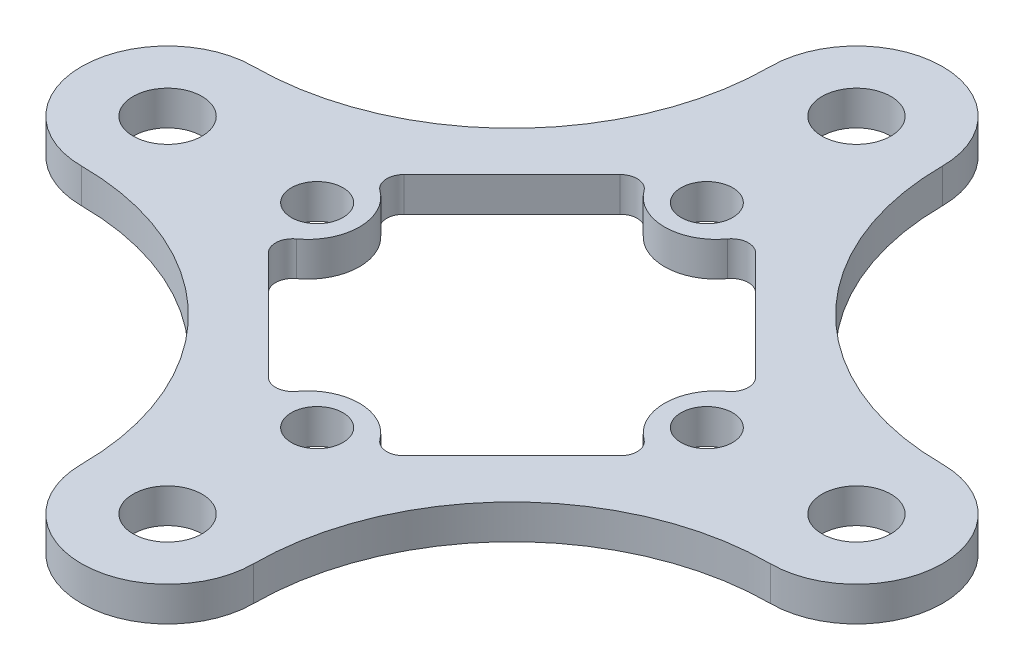
ISO-10303-21;
HEADER;
FILE_DESCRIPTION(('STEP AP214'),'2;1');
FILE_NAME('part.step','',(''),(''),'','','');
FILE_SCHEMA(('AUTOMOTIVE_DESIGN { 1 0 10303 214 1 1 1 1 }'));
ENDSEC;
DATA;
#1=APPLICATION_CONTEXT('core data for automotive mechanical design processes');
#2=APPLICATION_PROTOCOL_DEFINITION('international standard','automotive_design',2000,#1);
#3=PRODUCT_CONTEXT('',#1,'mechanical');
#4=PRODUCT('Part','Part','',(#3));
#5=PRODUCT_RELATED_PRODUCT_CATEGORY('part','',(#4));
#6=PRODUCT_DEFINITION_FORMATION('','',#4);
#7=PRODUCT_DEFINITION_CONTEXT('part definition',#1,'design');
#8=PRODUCT_DEFINITION('design','',#6,#7);
#9=PRODUCT_DEFINITION_SHAPE('','',#8);
#10=(LENGTH_UNIT() NAMED_UNIT(*) SI_UNIT(.MILLI.,.METRE.));
#11=(NAMED_UNIT(*) PLANE_ANGLE_UNIT() SI_UNIT($,.RADIAN.));
#12=(NAMED_UNIT(*) SI_UNIT($,.STERADIAN.) SOLID_ANGLE_UNIT());
#13=UNCERTAINTY_MEASURE_WITH_UNIT(LENGTH_MEASURE(1.E-05),#10,'distance_accuracy_value','');
#14=(GEOMETRIC_REPRESENTATION_CONTEXT(3) GLOBAL_UNCERTAINTY_ASSIGNED_CONTEXT((#13)) GLOBAL_UNIT_ASSIGNED_CONTEXT((#10,
#11,#12)) REPRESENTATION_CONTEXT('',''));
#15=CARTESIAN_POINT('',(0.,0.,0.));
#16=DIRECTION('',(0.,0.,1.));
#17=DIRECTION('',(1.,0.,0.));
#18=AXIS2_PLACEMENT_3D('',#15,#16,#17);
#19=CARTESIAN_POINT('',(20.,2.,-20.));
#20=DIRECTION('',(0.,-1.,0.));
#21=DIRECTION('',(0.,0.,-1.));
#22=AXIS2_PLACEMENT_3D('',#19,#20,#21);
#23=CYLINDRICAL_SURFACE('',#22,15.);
#24=CARTESIAN_POINT('',(20.,0.,-20.));
#25=DIRECTION('',(0.,1.,0.));
#26=DIRECTION('',(0.,0.,1.));
#27=AXIS2_PLACEMENT_3D('',#24,#25,#26);
#28=CIRCLE('',#27,15.);
#29=CARTESIAN_POINT('',(5.,0.,-20.));
#30=VERTEX_POINT('',#29);
#31=CARTESIAN_POINT('',(20.,0.,-5.));
#32=VERTEX_POINT('',#31);
#33=EDGE_CURVE('E260',#30,#32,#28,.T.);
#34=ORIENTED_EDGE('',*,*,#33,.F.);
#35=DIRECTION('',(0.,-1.,0.));
#36=VECTOR('',#35,1.);
#37=CARTESIAN_POINT('',(5.,2.,-20.));
#38=LINE('',#37,#36);
#39=CARTESIAN_POINT('',(5.,2.,-20.));
#40=VERTEX_POINT('',#39);
#41=EDGE_CURVE('E275',#40,#30,#38,.T.);
#42=ORIENTED_EDGE('',*,*,#41,.F.);
#43=CARTESIAN_POINT('',(20.,2.,-20.));
#44=DIRECTION('',(0.,1.,0.));
#45=DIRECTION('',(0.,0.,1.));
#46=AXIS2_PLACEMENT_3D('',#43,#44,#45);
#47=CIRCLE('',#46,15.);
#48=CARTESIAN_POINT('',(20.,2.,-5.));
#49=VERTEX_POINT('',#48);
#50=EDGE_CURVE('E261',#40,#49,#47,.T.);
#51=ORIENTED_EDGE('',*,*,#50,.T.);
#52=DIRECTION('',(0.,-1.,0.));
#53=VECTOR('',#52,1.);
#54=CARTESIAN_POINT('',(20.,2.,-5.));
#55=LINE('',#54,#53);
#56=EDGE_CURVE('E268',#49,#32,#55,.T.);
#57=ORIENTED_EDGE('',*,*,#56,.T.);
#58=EDGE_LOOP('',(#34,#42,#51,#57));
#59=FACE_BOUND('',#58,.T.);
#60=ADVANCED_FACE('F37',(#59),#23,.F.);
#61=CARTESIAN_POINT('',(0.,2.,-20.));
#62=DIRECTION('',(0.,-1.,0.));
#63=DIRECTION('',(0.,0.,-1.));
#64=AXIS2_PLACEMENT_3D('',#61,#62,#63);
#65=CYLINDRICAL_SURFACE('',#64,5.);
#66=CARTESIAN_POINT('',(0.,0.,-20.));
#67=DIRECTION('',(0.,1.,0.));
#68=DIRECTION('',(0.,0.,1.));
#69=AXIS2_PLACEMENT_3D('',#66,#67,#68);
#70=CIRCLE('',#69,5.);
#71=CARTESIAN_POINT('',(-4.99999999999979,0.,-20.0000000000001));
#72=VERTEX_POINT('',#71);
#73=EDGE_CURVE('E271',#30,#72,#70,.T.);
#74=ORIENTED_EDGE('',*,*,#73,.T.);
#75=DIRECTION('',(0.,-1.,0.));
#76=VECTOR('',#75,1.);
#77=CARTESIAN_POINT('',(-4.99999999999979,2.,-20.0000000000001));
#78=LINE('',#77,#76);
#79=CARTESIAN_POINT('',(-4.99999999999979,2.,-20.0000000000001));
#80=VERTEX_POINT('',#79);
#81=EDGE_CURVE('E220',#80,#72,#78,.T.);
#82=ORIENTED_EDGE('',*,*,#81,.F.);
#83=CARTESIAN_POINT('',(0.,2.,-20.));
#84=DIRECTION('',(0.,1.,0.));
#85=DIRECTION('',(0.,0.,1.));
#86=AXIS2_PLACEMENT_3D('',#83,#84,#85);
#87=CIRCLE('',#86,5.);
#88=EDGE_CURVE('E226',#40,#80,#87,.T.);
#89=ORIENTED_EDGE('',*,*,#88,.F.);
#90=ORIENTED_EDGE('',*,*,#41,.T.);
#91=EDGE_LOOP('',(#74,#82,#89,#90));
#92=FACE_BOUND('',#91,.T.);
#93=ADVANCED_FACE('F449',(#92),#65,.T.);
#94=CARTESIAN_POINT('',(20.,2.,0.));
#95=DIRECTION('',(0.,-1.,0.));
#96=DIRECTION('',(0.,0.,-1.));
#97=AXIS2_PLACEMENT_3D('',#94,#95,#96);
#98=CYLINDRICAL_SURFACE('',#97,5.);
#99=CARTESIAN_POINT('',(20.,0.,0.));
#100=DIRECTION('',(0.,1.,0.));
#101=DIRECTION('',(0.,0.,1.));
#102=AXIS2_PLACEMENT_3D('',#99,#100,#101);
#103=CIRCLE('',#102,5.);
#104=CARTESIAN_POINT('',(20.,0.,5.00000000000007));
#105=VERTEX_POINT('',#104);
#106=EDGE_CURVE('E264',#32,#105,#103,.F.);
#107=ORIENTED_EDGE('',*,*,#106,.F.);
#108=ORIENTED_EDGE('',*,*,#56,.F.);
#109=CARTESIAN_POINT('',(20.,2.,0.));
#110=DIRECTION('',(0.,1.,0.));
#111=DIRECTION('',(0.,0.,1.));
#112=AXIS2_PLACEMENT_3D('',#109,#110,#111);
#113=CIRCLE('',#112,5.);
#114=CARTESIAN_POINT('',(20.,2.,5.00000000000007));
#115=VERTEX_POINT('',#114);
#116=EDGE_CURVE('E266',#49,#115,#113,.F.);
#117=ORIENTED_EDGE('',*,*,#116,.T.);
#118=DIRECTION('',(0.,-1.,0.));
#119=VECTOR('',#118,1.);
#120=CARTESIAN_POINT('',(20.,2.,5.00000000000007));
#121=LINE('',#120,#119);
#122=EDGE_CURVE('E257',#115,#105,#121,.T.);
#123=ORIENTED_EDGE('',*,*,#122,.T.);
#124=EDGE_LOOP('',(#107,#108,#117,#123));
#125=FACE_BOUND('',#124,.T.);
#126=ADVANCED_FACE('F441',(#125),#98,.T.);
#127=CARTESIAN_POINT('',(0.,2.,0.));
#128=DIRECTION('',(0.,1.,0.));
#129=DIRECTION('',(0.,0.,1.));
#130=AXIS2_PLACEMENT_3D('',#127,#128,#129);
#131=PLANE('',#130);
#132=CARTESIAN_POINT('',(-11.8595682327954,2.,0.));
#133=DIRECTION('',(0.,-1.,0.));
#134=DIRECTION('',(0.,0.,1.));
#135=AXIS2_PLACEMENT_3D('',#132,#133,#134);
#136=CIRCLE('',#135,3.);
#137=CARTESIAN_POINT('',(-10.0890226450771,2.,-2.42181095914016));
#138=VERTEX_POINT('',#137);
#139=CARTESIAN_POINT('',(-10.0890226450771,2.,2.42181095914015));
#140=VERTEX_POINT('',#139);
#141=EDGE_CURVE('E376',#138,#140,#136,.T.);
#142=ORIENTED_EDGE('',*,*,#141,.F.);
#143=CARTESIAN_POINT('',(-9.49884078250433,2.,-3.22908127885354));
#144=DIRECTION('',(0.,1.,0.));
#145=DIRECTION('',(0.,0.,1.));
#146=AXIS2_PLACEMENT_3D('',#143,#144,#145);
#147=CIRCLE('',#146,1.);
#148=CARTESIAN_POINT('',(-10.2059475636909,2.,-3.93618806004009));
#149=VERTEX_POINT('',#148);
#150=EDGE_CURVE('E320',#138,#149,#147,.F.);
#151=ORIENTED_EDGE('',*,*,#150,.T.);
#152=DIRECTION('',(-0.707106781186551,0.,0.707106781186544));
#153=VECTOR('',#152,1.);
#154=CARTESIAN_POINT('',(-11.2127044157633,2.,-2.92943120796764));
#155=LINE('',#154,#153);
#156=CARTESIAN_POINT('',(-3.93618806004006,2.,-10.2059475636908));
#157=VERTEX_POINT('',#156);
#158=EDGE_CURVE('E349',#157,#149,#155,.T.);
#159=ORIENTED_EDGE('',*,*,#158,.F.);
#160=CARTESIAN_POINT('',(-3.22908127885352,2.,-9.49884078250429));
#161=DIRECTION('',(0.,1.,0.));
#162=DIRECTION('',(0.,0.,1.));
#163=AXIS2_PLACEMENT_3D('',#160,#161,#162);
#164=CIRCLE('',#163,1.);
#165=CARTESIAN_POINT('',(-2.42181095914014,2.,-10.0890226450771));
#166=VERTEX_POINT('',#165);
#167=EDGE_CURVE('E45',#157,#166,#164,.F.);
#168=ORIENTED_EDGE('',*,*,#167,.T.);
#169=CARTESIAN_POINT('',(0.,2.,-11.8595682327954));
#170=DIRECTION('',(0.,-1.,0.));
#171=DIRECTION('',(0.,0.,1.));
#172=AXIS2_PLACEMENT_3D('',#169,#170,#171);
#173=CIRCLE('',#172,3.);
#174=CARTESIAN_POINT('',(2.42181095914015,2.,-10.0890226450771));
#175=VERTEX_POINT('',#174);
#176=EDGE_CURVE('E347',#175,#166,#173,.T.);
#177=ORIENTED_EDGE('',*,*,#176,.F.);
#178=CARTESIAN_POINT('',(3.22908127885354,2.,-9.49884078250432));
#179=DIRECTION('',(0.,1.,0.));
#180=DIRECTION('',(0.,0.,1.));
#181=AXIS2_PLACEMENT_3D('',#178,#179,#180);
#182=CIRCLE('',#181,1.);
#183=CARTESIAN_POINT('',(3.93618806004009,2.,-10.2059475636909));
#184=VERTEX_POINT('',#183);
#185=EDGE_CURVE('E340',#175,#184,#182,.F.);
#186=ORIENTED_EDGE('',*,*,#185,.T.);
#187=DIRECTION('',(-0.707106781186546,0.,-0.707106781186549));
#188=VECTOR('',#187,1.);
#189=CARTESIAN_POINT('',(2.92943120796764,2.,-11.2127044157633));
#190=LINE('',#189,#188);
#191=CARTESIAN_POINT('',(10.2059475636909,2.,-3.93618806004008));
#192=VERTEX_POINT('',#191);
#193=EDGE_CURVE('E354',#192,#184,#190,.T.);
#194=ORIENTED_EDGE('',*,*,#193,.F.);
#195=CARTESIAN_POINT('',(9.49884078250431,2.,-3.22908127885353));
#196=DIRECTION('',(0.,1.,0.));
#197=DIRECTION('',(0.,0.,1.));
#198=AXIS2_PLACEMENT_3D('',#195,#196,#197);
#199=CIRCLE('',#198,1.);
#200=CARTESIAN_POINT('',(10.0890226450771,2.,-2.42181095914014));
#201=VERTEX_POINT('',#200);
#202=EDGE_CURVE('E336',#192,#201,#199,.F.);
#203=ORIENTED_EDGE('',*,*,#202,.T.);
#204=CARTESIAN_POINT('',(11.8595682327954,2.,0.));
#205=DIRECTION('',(0.,-1.,0.));
#206=DIRECTION('',(0.,0.,-1.));
#207=AXIS2_PLACEMENT_3D('',#204,#205,#206);
#208=CIRCLE('',#207,3.);
#209=CARTESIAN_POINT('',(10.0890226450771,2.,2.42181095914016));
#210=VERTEX_POINT('',#209);
#211=EDGE_CURVE('E388',#210,#201,#208,.T.);
#212=ORIENTED_EDGE('',*,*,#211,.F.);
#213=CARTESIAN_POINT('',(9.49884078250434,2.,3.22908127885355));
#214=DIRECTION('',(0.,1.,0.));
#215=DIRECTION('',(0.,0.,1.));
#216=AXIS2_PLACEMENT_3D('',#213,#214,#215);
#217=CIRCLE('',#216,1.);
#218=CARTESIAN_POINT('',(10.2059475636909,2.,3.9361880600401));
#219=VERTEX_POINT('',#218);
#220=EDGE_CURVE('E332',#210,#219,#217,.F.);
#221=ORIENTED_EDGE('',*,*,#220,.T.);
#222=DIRECTION('',(0.707106781186551,0.,-0.707106781186544));
#223=VECTOR('',#222,1.);
#224=CARTESIAN_POINT('',(11.2127044157633,2.,2.92943120796765));
#225=LINE('',#224,#223);
#226=CARTESIAN_POINT('',(3.93618806004006,2.,10.2059475636909));
#227=VERTEX_POINT('',#226);
#228=EDGE_CURVE('E385',#227,#219,#225,.T.);
#229=ORIENTED_EDGE('',*,*,#228,.F.);
#230=CARTESIAN_POINT('',(3.22908127885352,2.,9.4988407825043));
#231=DIRECTION('',(0.,1.,0.));
#232=DIRECTION('',(0.,0.,1.));
#233=AXIS2_PLACEMENT_3D('',#230,#231,#232);
#234=CIRCLE('',#233,1.);
#235=CARTESIAN_POINT('',(2.42181095914014,2.,10.0890226450771));
#236=VERTEX_POINT('',#235);
#237=EDGE_CURVE('E324',#227,#236,#234,.F.);
#238=ORIENTED_EDGE('',*,*,#237,.T.);
#239=CARTESIAN_POINT('',(0.,2.,11.8595682327954));
#240=DIRECTION('',(0.,-1.,0.));
#241=DIRECTION('',(0.,0.,1.));
#242=AXIS2_PLACEMENT_3D('',#239,#240,#241);
#243=CIRCLE('',#242,3.);
#244=CARTESIAN_POINT('',(-2.42181095914015,2.,10.0890226450771));
#245=VERTEX_POINT('',#244);
#246=EDGE_CURVE('E382',#245,#236,#243,.T.);
#247=ORIENTED_EDGE('',*,*,#246,.F.);
#248=CARTESIAN_POINT('',(-3.22908127885354,2.,9.49884078250432));
#249=DIRECTION('',(0.,1.,0.));
#250=DIRECTION('',(0.,0.,1.));
#251=AXIS2_PLACEMENT_3D('',#248,#249,#250);
#252=CIRCLE('',#251,1.);
#253=CARTESIAN_POINT('',(-3.93618806004009,2.,10.2059475636909));
#254=VERTEX_POINT('',#253);
#255=EDGE_CURVE('E328',#245,#254,#252,.F.);
#256=ORIENTED_EDGE('',*,*,#255,.T.);
#257=DIRECTION('',(0.707106781186546,0.,0.707106781186549));
#258=VECTOR('',#257,1.);
#259=CARTESIAN_POINT('',(-2.92943120796764,2.,11.2127044157633));
#260=LINE('',#259,#258);
#261=CARTESIAN_POINT('',(-10.2059475636909,2.,3.93618806004008));
#262=VERTEX_POINT('',#261);
#263=EDGE_CURVE('E379',#262,#254,#260,.T.);
#264=ORIENTED_EDGE('',*,*,#263,.F.);
#265=CARTESIAN_POINT('',(-9.49884078250431,2.,3.22908127885353));
#266=DIRECTION('',(0.,1.,0.));
#267=DIRECTION('',(0.,0.,1.));
#268=AXIS2_PLACEMENT_3D('',#265,#266,#267);
#269=CIRCLE('',#268,1.);
#270=EDGE_CURVE('E316',#262,#140,#269,.F.);
#271=ORIENTED_EDGE('',*,*,#270,.T.);
#272=EDGE_LOOP('',(#142,#151,#159,#168,#177,#186,#194,#203,#212,#221,#229,#238,#247,#256,#264,#271));
#273=FACE_BOUND('',#272,.T.);
#274=CARTESIAN_POINT('',(0.,2.,11.3137084989848));
#275=DIRECTION('',(0.,1.,0.));
#276=DIRECTION('',(0.,0.,1.));
#277=AXIS2_PLACEMENT_3D('',#274,#275,#276);
#278=CIRCLE('',#277,1.5);
#279=CARTESIAN_POINT('',(0.,2.,12.8137084989848));
#280=VERTEX_POINT('',#279);
#281=EDGE_CURVE('E398',#280,#280,#278,.T.);
#282=ORIENTED_EDGE('',*,*,#281,.F.);
#283=EDGE_LOOP('',(#282));
#284=FACE_BOUND('',#283,.T.);
#285=CARTESIAN_POINT('',(20.,2.,0.));
#286=DIRECTION('',(0.,1.,0.));
#287=DIRECTION('',(0.,0.,1.));
#288=AXIS2_PLACEMENT_3D('',#285,#286,#287);
#289=CIRCLE('',#288,2.);
#290=CARTESIAN_POINT('',(20.,2.,2.00000000000007));
#291=VERTEX_POINT('',#290);
#292=EDGE_CURVE('E414',#291,#291,#289,.T.);
#293=ORIENTED_EDGE('',*,*,#292,.F.);
#294=EDGE_LOOP('',(#293));
#295=FACE_BOUND('',#294,.T.);
#296=CARTESIAN_POINT('',(11.3137084989848,2.,0.));
#297=DIRECTION('',(0.,1.,0.));
#298=DIRECTION('',(0.,0.,1.));
#299=AXIS2_PLACEMENT_3D('',#296,#297,#298);
#300=CIRCLE('',#299,1.5);
#301=CARTESIAN_POINT('',(11.3137084989848,2.,1.50000000000004));
#302=VERTEX_POINT('',#301);
#303=EDGE_CURVE('E413',#302,#302,#300,.T.);
#304=ORIENTED_EDGE('',*,*,#303,.F.);
#305=EDGE_LOOP('',(#304));
#306=FACE_BOUND('',#305,.T.);
#307=CARTESIAN_POINT('',(0.,2.,-20.));
#308=DIRECTION('',(0.,1.,0.));
#309=DIRECTION('',(0.,0.,1.));
#310=AXIS2_PLACEMENT_3D('',#307,#308,#309);
#311=CIRCLE('',#310,2.);
#312=CARTESIAN_POINT('',(0.,2.,-18.));
#313=VERTEX_POINT('',#312);
#314=EDGE_CURVE('E425',#313,#313,#311,.T.);
#315=ORIENTED_EDGE('',*,*,#314,.F.);
#316=EDGE_LOOP('',(#315));
#317=FACE_BOUND('',#316,.T.);
#318=CARTESIAN_POINT('',(6.40017045915262E-13,2.,20.));
#319=DIRECTION('',(0.,1.,0.));
#320=DIRECTION('',(0.,0.,1.));
#321=AXIS2_PLACEMENT_3D('',#318,#319,#320);
#322=CIRCLE('',#321,2.00000000000075);
#323=CARTESIAN_POINT('',(6.40017045915262E-13,2.,22.0000000000007));
#324=VERTEX_POINT('',#323);
#325=EDGE_CURVE('E399',#324,#324,#322,.T.);
#326=ORIENTED_EDGE('',*,*,#325,.F.);
#327=EDGE_LOOP('',(#326));
#328=FACE_BOUND('',#327,.T.);
#329=CARTESIAN_POINT('',(-11.3137084989848,2.,-1.18504806291949E-13));
#330=DIRECTION('',(0.,1.,0.));
#331=DIRECTION('',(0.,0.,1.));
#332=AXIS2_PLACEMENT_3D('',#329,#330,#331);
#333=CIRCLE('',#332,1.5);
#334=CARTESIAN_POINT('',(-11.3137084989848,2.,1.49999999999988));
#335=VERTEX_POINT('',#334);
#336=EDGE_CURVE('E405',#335,#335,#333,.T.);
#337=ORIENTED_EDGE('',*,*,#336,.F.);
#338=EDGE_LOOP('',(#337));
#339=FACE_BOUND('',#338,.T.);
#340=CARTESIAN_POINT('',(-20.,2.,-2.09488880330588E-13));
#341=DIRECTION('',(0.,1.,0.));
#342=DIRECTION('',(0.,0.,1.));
#343=AXIS2_PLACEMENT_3D('',#340,#341,#342);
#344=CIRCLE('',#343,2.);
#345=CARTESIAN_POINT('',(-20.,2.,1.99999999999979));
#346=VERTEX_POINT('',#345);
#347=EDGE_CURVE('E367',#346,#346,#344,.T.);
#348=ORIENTED_EDGE('',*,*,#347,.F.);
#349=EDGE_LOOP('',(#348));
#350=FACE_BOUND('',#349,.T.);
#351=CARTESIAN_POINT('',(0.,2.,-11.3137084989848));
#352=DIRECTION('',(0.,1.,0.));
#353=DIRECTION('',(0.,0.,1.));
#354=AXIS2_PLACEMENT_3D('',#351,#352,#353);
#355=CIRCLE('',#354,1.5);
#356=CARTESIAN_POINT('',(0.,2.,-9.81370849898476));
#357=VERTEX_POINT('',#356);
#358=EDGE_CURVE('E233',#357,#357,#355,.T.);
#359=ORIENTED_EDGE('',*,*,#358,.F.);
#360=EDGE_LOOP('',(#359));
#361=FACE_BOUND('',#360,.T.);
#362=CARTESIAN_POINT('',(19.9999999999999,2.,20.0000000000001));
#363=DIRECTION('',(0.,1.,0.));
#364=DIRECTION('',(-1.,0.,0.));
#365=AXIS2_PLACEMENT_3D('',#362,#363,#364);
#366=CIRCLE('',#365,15.);
#367=CARTESIAN_POINT('',(4.99999999999993,2.,20.));
#368=VERTEX_POINT('',#367);
#369=EDGE_CURVE('E246',#115,#368,#366,.T.);
#370=ORIENTED_EDGE('',*,*,#369,.F.);
#371=ORIENTED_EDGE('',*,*,#116,.F.);
#372=ORIENTED_EDGE('',*,*,#50,.F.);
#373=ORIENTED_EDGE('',*,*,#88,.T.);
#374=CARTESIAN_POINT('',(-19.9999999999998,2.,-20.0000000000002));
#375=DIRECTION('',(0.,1.,0.));
#376=DIRECTION('',(1.,0.,0.));
#377=AXIS2_PLACEMENT_3D('',#374,#375,#376);
#378=CIRCLE('',#377,15.);
#379=CARTESIAN_POINT('',(-19.9999999999999,2.,-5.00000000000021));
#380=VERTEX_POINT('',#379);
#381=EDGE_CURVE('E216',#380,#80,#378,.T.);
#382=ORIENTED_EDGE('',*,*,#381,.F.);
#383=CARTESIAN_POINT('',(-20.,2.,0.));
#384=DIRECTION('',(0.,1.,0.));
#385=DIRECTION('',(0.,0.,-1.));
#386=AXIS2_PLACEMENT_3D('',#383,#384,#385);
#387=CIRCLE('',#386,5.);
#388=CARTESIAN_POINT('',(-20.,2.,5.));
#389=VERTEX_POINT('',#388);
#390=EDGE_CURVE('E199',#389,#380,#387,.F.);
#391=ORIENTED_EDGE('',*,*,#390,.F.);
#392=CARTESIAN_POINT('',(-20.,2.,20.));
#393=DIRECTION('',(0.,1.,0.));
#394=DIRECTION('',(0.,0.,-1.));
#395=AXIS2_PLACEMENT_3D('',#392,#393,#394);
#396=CIRCLE('',#395,15.);
#397=CARTESIAN_POINT('',(-5.,2.,20.));
#398=VERTEX_POINT('',#397);
#399=EDGE_CURVE('E210',#398,#389,#396,.T.);
#400=ORIENTED_EDGE('',*,*,#399,.F.);
#401=CARTESIAN_POINT('',(0.,2.,20.));
#402=DIRECTION('',(0.,1.,0.));
#403=DIRECTION('',(-1.,0.,0.));
#404=AXIS2_PLACEMENT_3D('',#401,#402,#403);
#405=CIRCLE('',#404,5.);
#406=EDGE_CURVE('E249',#368,#398,#405,.F.);
#407=ORIENTED_EDGE('',*,*,#406,.F.);
#408=EDGE_LOOP('',(#370,#371,#372,#373,#382,#391,#400,#407));
#409=FACE_BOUND('',#408,.T.);
#410=ADVANCED_FACE('F223',(#273,#284,#295,#306,#317,#328,#339,#350,#361,#409),#131,.T.);
#411=CARTESIAN_POINT('',(0.,0.,0.));
#412=DIRECTION('',(0.,1.,0.));
#413=DIRECTION('',(0.,0.,1.));
#414=AXIS2_PLACEMENT_3D('',#411,#412,#413);
#415=PLANE('',#414);
#416=CARTESIAN_POINT('',(0.,0.,-11.8595682327954));
#417=DIRECTION('',(0.,-1.,0.));
#418=DIRECTION('',(0.,0.,1.));
#419=AXIS2_PLACEMENT_3D('',#416,#417,#418);
#420=CIRCLE('',#419,3.);
#421=CARTESIAN_POINT('',(2.42181095914015,0.,-10.0890226450771));
#422=VERTEX_POINT('',#421);
#423=CARTESIAN_POINT('',(-2.42181095914014,0.,-10.0890226450771));
#424=VERTEX_POINT('',#423);
#425=EDGE_CURVE('E363',#422,#424,#420,.T.);
#426=ORIENTED_EDGE('',*,*,#425,.T.);
#427=CARTESIAN_POINT('',(-3.22908127885352,0.,-9.49884078250429));
#428=DIRECTION('',(0.,1.,0.));
#429=DIRECTION('',(0.,0.,1.));
#430=AXIS2_PLACEMENT_3D('',#427,#428,#429);
#431=CIRCLE('',#430,1.);
#432=CARTESIAN_POINT('',(-3.93618806004006,0.,-10.2059475636908));
#433=VERTEX_POINT('',#432);
#434=EDGE_CURVE('E11',#424,#433,#431,.T.);
#435=ORIENTED_EDGE('',*,*,#434,.T.);
#436=DIRECTION('',(-0.707106781186551,0.,0.707106781186544));
#437=VECTOR('',#436,1.);
#438=CARTESIAN_POINT('',(-11.2127044157633,0.,-2.92943120796764));
#439=LINE('',#438,#437);
#440=CARTESIAN_POINT('',(-10.2059475636909,0.,-3.93618806004009));
#441=VERTEX_POINT('',#440);
#442=EDGE_CURVE('E361',#433,#441,#439,.T.);
#443=ORIENTED_EDGE('',*,*,#442,.T.);
#444=CARTESIAN_POINT('',(-9.49884078250433,0.,-3.22908127885354));
#445=DIRECTION('',(0.,1.,0.));
#446=DIRECTION('',(0.,0.,1.));
#447=AXIS2_PLACEMENT_3D('',#444,#445,#446);
#448=CIRCLE('',#447,1.);
#449=CARTESIAN_POINT('',(-10.0890226450771,0.,-2.42181095914016));
#450=VERTEX_POINT('',#449);
#451=EDGE_CURVE('E322',#441,#450,#448,.T.);
#452=ORIENTED_EDGE('',*,*,#451,.T.);
#453=CARTESIAN_POINT('',(-11.8595682327954,0.,0.));
#454=DIRECTION('',(0.,-1.,0.));
#455=DIRECTION('',(0.,0.,1.));
#456=AXIS2_PLACEMENT_3D('',#453,#454,#455);
#457=CIRCLE('',#456,3.);
#458=CARTESIAN_POINT('',(-10.0890226450771,0.,2.42181095914015));
#459=VERTEX_POINT('',#458);
#460=EDGE_CURVE('E394',#450,#459,#457,.T.);
#461=ORIENTED_EDGE('',*,*,#460,.T.);
#462=CARTESIAN_POINT('',(-9.49884078250431,0.,3.22908127885353));
#463=DIRECTION('',(0.,1.,0.));
#464=DIRECTION('',(0.,0.,1.));
#465=AXIS2_PLACEMENT_3D('',#462,#463,#464);
#466=CIRCLE('',#465,1.);
#467=CARTESIAN_POINT('',(-10.2059475636909,0.,3.93618806004008));
#468=VERTEX_POINT('',#467);
#469=EDGE_CURVE('E318',#459,#468,#466,.T.);
#470=ORIENTED_EDGE('',*,*,#469,.T.);
#471=DIRECTION('',(0.707106781186546,0.,0.707106781186549));
#472=VECTOR('',#471,1.);
#473=CARTESIAN_POINT('',(-2.92943120796764,0.,11.2127044157633));
#474=LINE('',#473,#472);
#475=CARTESIAN_POINT('',(-3.93618806004009,0.,10.2059475636909));
#476=VERTEX_POINT('',#475);
#477=EDGE_CURVE('E533',#468,#476,#474,.T.);
#478=ORIENTED_EDGE('',*,*,#477,.T.);
#479=CARTESIAN_POINT('',(-3.22908127885354,0.,9.49884078250432));
#480=DIRECTION('',(0.,1.,0.));
#481=DIRECTION('',(0.,0.,1.));
#482=AXIS2_PLACEMENT_3D('',#479,#480,#481);
#483=CIRCLE('',#482,1.);
#484=CARTESIAN_POINT('',(-2.42181095914015,0.,10.0890226450771));
#485=VERTEX_POINT('',#484);
#486=EDGE_CURVE('E330',#476,#485,#483,.T.);
#487=ORIENTED_EDGE('',*,*,#486,.T.);
#488=CARTESIAN_POINT('',(0.,0.,11.8595682327954));
#489=DIRECTION('',(0.,-1.,0.));
#490=DIRECTION('',(0.,0.,1.));
#491=AXIS2_PLACEMENT_3D('',#488,#489,#490);
#492=CIRCLE('',#491,3.);
#493=CARTESIAN_POINT('',(2.42181095914014,0.,10.0890226450771));
#494=VERTEX_POINT('',#493);
#495=EDGE_CURVE('E525',#485,#494,#492,.T.);
#496=ORIENTED_EDGE('',*,*,#495,.T.);
#497=CARTESIAN_POINT('',(3.22908127885352,0.,9.4988407825043));
#498=DIRECTION('',(0.,1.,0.));
#499=DIRECTION('',(0.,0.,1.));
#500=AXIS2_PLACEMENT_3D('',#497,#498,#499);
#501=CIRCLE('',#500,1.);
#502=CARTESIAN_POINT('',(3.93618806004006,0.,10.2059475636909));
#503=VERTEX_POINT('',#502);
#504=EDGE_CURVE('E326',#494,#503,#501,.T.);
#505=ORIENTED_EDGE('',*,*,#504,.T.);
#506=DIRECTION('',(0.707106781186551,0.,-0.707106781186544));
#507=VECTOR('',#506,1.);
#508=CARTESIAN_POINT('',(11.2127044157633,0.,2.92943120796765));
#509=LINE('',#508,#507);
#510=CARTESIAN_POINT('',(10.2059475636909,0.,3.9361880600401));
#511=VERTEX_POINT('',#510);
#512=EDGE_CURVE('E516',#503,#511,#509,.T.);
#513=ORIENTED_EDGE('',*,*,#512,.T.);
#514=CARTESIAN_POINT('',(9.49884078250434,0.,3.22908127885355));
#515=DIRECTION('',(0.,1.,0.));
#516=DIRECTION('',(0.,0.,1.));
#517=AXIS2_PLACEMENT_3D('',#514,#515,#516);
#518=CIRCLE('',#517,1.);
#519=CARTESIAN_POINT('',(10.0890226450771,0.,2.42181095914016));
#520=VERTEX_POINT('',#519);
#521=EDGE_CURVE('E334',#511,#520,#518,.T.);
#522=ORIENTED_EDGE('',*,*,#521,.T.);
#523=CARTESIAN_POINT('',(11.8595682327954,0.,0.));
#524=DIRECTION('',(0.,-1.,0.));
#525=DIRECTION('',(0.,0.,-1.));
#526=AXIS2_PLACEMENT_3D('',#523,#524,#525);
#527=CIRCLE('',#526,3.);
#528=CARTESIAN_POINT('',(10.0890226450771,0.,-2.42181095914014));
#529=VERTEX_POINT('',#528);
#530=EDGE_CURVE('E507',#520,#529,#527,.T.);
#531=ORIENTED_EDGE('',*,*,#530,.T.);
#532=CARTESIAN_POINT('',(9.49884078250431,0.,-3.22908127885353));
#533=DIRECTION('',(0.,1.,0.));
#534=DIRECTION('',(0.,0.,1.));
#535=AXIS2_PLACEMENT_3D('',#532,#533,#534);
#536=CIRCLE('',#535,1.);
#537=CARTESIAN_POINT('',(10.2059475636909,0.,-3.93618806004008));
#538=VERTEX_POINT('',#537);
#539=EDGE_CURVE('E338',#529,#538,#536,.T.);
#540=ORIENTED_EDGE('',*,*,#539,.T.);
#541=DIRECTION('',(-0.707106781186546,0.,-0.707106781186549));
#542=VECTOR('',#541,1.);
#543=CARTESIAN_POINT('',(2.92943120796764,0.,-11.2127044157633));
#544=LINE('',#543,#542);
#545=CARTESIAN_POINT('',(3.93618806004009,0.,-10.2059475636909));
#546=VERTEX_POINT('',#545);
#547=EDGE_CURVE('E372',#538,#546,#544,.T.);
#548=ORIENTED_EDGE('',*,*,#547,.T.);
#549=CARTESIAN_POINT('',(3.22908127885354,0.,-9.49884078250432));
#550=DIRECTION('',(0.,1.,0.));
#551=DIRECTION('',(0.,0.,1.));
#552=AXIS2_PLACEMENT_3D('',#549,#550,#551);
#553=CIRCLE('',#552,1.);
#554=EDGE_CURVE('E59',#546,#422,#553,.T.);
#555=ORIENTED_EDGE('',*,*,#554,.T.);
#556=EDGE_LOOP('',(#426,#435,#443,#452,#461,#470,#478,#487,#496,#505,#513,#522,#531,#540,#548,#555));
#557=FACE_BOUND('',#556,.T.);
#558=CARTESIAN_POINT('',(0.,0.,11.3137084989848));
#559=DIRECTION('',(0.,1.,0.));
#560=DIRECTION('',(0.,0.,1.));
#561=AXIS2_PLACEMENT_3D('',#558,#559,#560);
#562=CIRCLE('',#561,1.5);
#563=CARTESIAN_POINT('',(0.,0.,12.8137084989848));
#564=VERTEX_POINT('',#563);
#565=EDGE_CURVE('E417',#564,#564,#562,.T.);
#566=ORIENTED_EDGE('',*,*,#565,.T.);
#567=EDGE_LOOP('',(#566));
#568=FACE_BOUND('',#567,.T.);
#569=CARTESIAN_POINT('',(20.,0.,0.));
#570=DIRECTION('',(0.,1.,0.));
#571=DIRECTION('',(0.,0.,1.));
#572=AXIS2_PLACEMENT_3D('',#569,#570,#571);
#573=CIRCLE('',#572,2.);
#574=CARTESIAN_POINT('',(20.,0.,2.00000000000007));
#575=VERTEX_POINT('',#574);
#576=EDGE_CURVE('E410',#575,#575,#573,.T.);
#577=ORIENTED_EDGE('',*,*,#576,.T.);
#578=EDGE_LOOP('',(#577));
#579=FACE_BOUND('',#578,.T.);
#580=CARTESIAN_POINT('',(11.3137084989848,0.,0.));
#581=DIRECTION('',(0.,1.,0.));
#582=DIRECTION('',(0.,0.,1.));
#583=AXIS2_PLACEMENT_3D('',#580,#581,#582);
#584=CIRCLE('',#583,1.5);
#585=CARTESIAN_POINT('',(11.3137084989848,0.,1.50000000000004));
#586=VERTEX_POINT('',#585);
#587=EDGE_CURVE('E428',#586,#586,#584,.T.);
#588=ORIENTED_EDGE('',*,*,#587,.T.);
#589=EDGE_LOOP('',(#588));
#590=FACE_BOUND('',#589,.T.);
#591=CARTESIAN_POINT('',(0.,0.,-20.));
#592=DIRECTION('',(0.,1.,0.));
#593=DIRECTION('',(0.,0.,1.));
#594=AXIS2_PLACEMENT_3D('',#591,#592,#593);
#595=CIRCLE('',#594,2.);
#596=CARTESIAN_POINT('',(0.,0.,-18.));
#597=VERTEX_POINT('',#596);
#598=EDGE_CURVE('E422',#597,#597,#595,.T.);
#599=ORIENTED_EDGE('',*,*,#598,.T.);
#600=EDGE_LOOP('',(#599));
#601=FACE_BOUND('',#600,.T.);
#602=CARTESIAN_POINT('',(6.40017045915262E-13,0.,20.));
#603=DIRECTION('',(0.,1.,0.));
#604=DIRECTION('',(0.,0.,1.));
#605=AXIS2_PLACEMENT_3D('',#602,#603,#604);
#606=CIRCLE('',#605,2.00000000000075);
#607=CARTESIAN_POINT('',(6.40017045915262E-13,0.,22.0000000000007));
#608=VERTEX_POINT('',#607);
#609=EDGE_CURVE('E395',#608,#608,#606,.T.);
#610=ORIENTED_EDGE('',*,*,#609,.T.);
#611=EDGE_LOOP('',(#610));
#612=FACE_BOUND('',#611,.T.);
#613=CARTESIAN_POINT('',(-11.3137084989848,0.,-1.18504806291949E-13));
#614=DIRECTION('',(0.,1.,0.));
#615=DIRECTION('',(0.,0.,1.));
#616=AXIS2_PLACEMENT_3D('',#613,#614,#615);
#617=CIRCLE('',#616,1.5);
#618=CARTESIAN_POINT('',(-11.3137084989848,0.,1.49999999999988));
#619=VERTEX_POINT('',#618);
#620=EDGE_CURVE('E402',#619,#619,#617,.T.);
#621=ORIENTED_EDGE('',*,*,#620,.T.);
#622=EDGE_LOOP('',(#621));
#623=FACE_BOUND('',#622,.T.);
#624=CARTESIAN_POINT('',(-20.,0.,-2.09488880330588E-13));
#625=DIRECTION('',(0.,1.,0.));
#626=DIRECTION('',(0.,0.,1.));
#627=AXIS2_PLACEMENT_3D('',#624,#625,#626);
#628=CIRCLE('',#627,2.);
#629=CARTESIAN_POINT('',(-20.,0.,1.99999999999979));
#630=VERTEX_POINT('',#629);
#631=EDGE_CURVE('E370',#630,#630,#628,.T.);
#632=ORIENTED_EDGE('',*,*,#631,.T.);
#633=EDGE_LOOP('',(#632));
#634=FACE_BOUND('',#633,.T.);
#635=CARTESIAN_POINT('',(0.,0.,-11.3137084989848));
#636=DIRECTION('',(0.,1.,0.));
#637=DIRECTION('',(0.,0.,1.));
#638=AXIS2_PLACEMENT_3D('',#635,#636,#637);
#639=CIRCLE('',#638,1.5);
#640=CARTESIAN_POINT('',(0.,0.,-9.81370849898476));
#641=VERTEX_POINT('',#640);
#642=EDGE_CURVE('E230',#641,#641,#639,.T.);
#643=ORIENTED_EDGE('',*,*,#642,.T.);
#644=EDGE_LOOP('',(#643));
#645=FACE_BOUND('',#644,.T.);
#646=ORIENTED_EDGE('',*,*,#106,.T.);
#647=CARTESIAN_POINT('',(19.9999999999999,0.,20.0000000000001));
#648=DIRECTION('',(0.,1.,0.));
#649=DIRECTION('',(-1.,0.,0.));
#650=AXIS2_PLACEMENT_3D('',#647,#648,#649);
#651=CIRCLE('',#650,15.);
#652=CARTESIAN_POINT('',(4.99999999999993,0.,20.));
#653=VERTEX_POINT('',#652);
#654=EDGE_CURVE('E245',#105,#653,#651,.T.);
#655=ORIENTED_EDGE('',*,*,#654,.T.);
#656=CARTESIAN_POINT('',(0.,0.,20.));
#657=DIRECTION('',(0.,1.,0.));
#658=DIRECTION('',(-1.,0.,0.));
#659=AXIS2_PLACEMENT_3D('',#656,#657,#658);
#660=CIRCLE('',#659,5.);
#661=CARTESIAN_POINT('',(-5.,0.,20.));
#662=VERTEX_POINT('',#661);
#663=EDGE_CURVE('E250',#653,#662,#660,.F.);
#664=ORIENTED_EDGE('',*,*,#663,.T.);
#665=CARTESIAN_POINT('',(-20.,0.,20.));
#666=DIRECTION('',(0.,1.,0.));
#667=DIRECTION('',(0.,0.,-1.));
#668=AXIS2_PLACEMENT_3D('',#665,#666,#667);
#669=CIRCLE('',#668,15.);
#670=CARTESIAN_POINT('',(-20.,0.,5.));
#671=VERTEX_POINT('',#670);
#672=EDGE_CURVE('E219',#662,#671,#669,.T.);
#673=ORIENTED_EDGE('',*,*,#672,.T.);
#674=CARTESIAN_POINT('',(-20.,0.,0.));
#675=DIRECTION('',(0.,1.,0.));
#676=DIRECTION('',(0.,0.,-1.));
#677=AXIS2_PLACEMENT_3D('',#674,#675,#676);
#678=CIRCLE('',#677,5.);
#679=CARTESIAN_POINT('',(-19.9999999999999,0.,-5.00000000000021));
#680=VERTEX_POINT('',#679);
#681=EDGE_CURVE('E236',#671,#680,#678,.F.);
#682=ORIENTED_EDGE('',*,*,#681,.T.);
#683=CARTESIAN_POINT('',(-19.9999999999998,0.,-20.0000000000002));
#684=DIRECTION('',(0.,1.,0.));
#685=DIRECTION('',(1.,0.,0.));
#686=AXIS2_PLACEMENT_3D('',#683,#684,#685);
#687=CIRCLE('',#686,15.);
#688=EDGE_CURVE('E218',#680,#72,#687,.T.);
#689=ORIENTED_EDGE('',*,*,#688,.T.);
#690=ORIENTED_EDGE('',*,*,#73,.F.);
#691=ORIENTED_EDGE('',*,*,#33,.T.);
#692=EDGE_LOOP('',(#646,#655,#664,#673,#682,#689,#690,#691));
#693=FACE_BOUND('',#692,.T.);
#694=ADVANCED_FACE('F359',(#557,#568,#579,#590,#601,#612,#623,#634,#645,#693),#415,.F.);
#695=CARTESIAN_POINT('',(19.9999999999999,2.,20.0000000000001));
#696=DIRECTION('',(0.,-1.,0.));
#697=DIRECTION('',(0.,0.,-1.));
#698=AXIS2_PLACEMENT_3D('',#695,#696,#697);
#699=CYLINDRICAL_SURFACE('',#698,15.);
#700=ORIENTED_EDGE('',*,*,#654,.F.);
#701=ORIENTED_EDGE('',*,*,#122,.F.);
#702=ORIENTED_EDGE('',*,*,#369,.T.);
#703=DIRECTION('',(0.,-1.,0.));
#704=VECTOR('',#703,1.);
#705=CARTESIAN_POINT('',(4.99999999999993,2.,20.));
#706=LINE('',#705,#704);
#707=EDGE_CURVE('E252',#368,#653,#706,.T.);
#708=ORIENTED_EDGE('',*,*,#707,.T.);
#709=EDGE_LOOP('',(#700,#701,#702,#708));
#710=FACE_BOUND('',#709,.T.);
#711=ADVANCED_FACE('F447',(#710),#699,.F.);
#712=CARTESIAN_POINT('',(0.,2.,20.));
#713=DIRECTION('',(0.,-1.,0.));
#714=DIRECTION('',(0.,0.,-1.));
#715=AXIS2_PLACEMENT_3D('',#712,#713,#714);
#716=CYLINDRICAL_SURFACE('',#715,5.);
#717=ORIENTED_EDGE('',*,*,#663,.F.);
#718=ORIENTED_EDGE('',*,*,#707,.F.);
#719=ORIENTED_EDGE('',*,*,#406,.T.);
#720=DIRECTION('',(0.,-1.,0.));
#721=VECTOR('',#720,1.);
#722=CARTESIAN_POINT('',(-5.,2.,20.));
#723=LINE('',#722,#721);
#724=EDGE_CURVE('E242',#398,#662,#723,.T.);
#725=ORIENTED_EDGE('',*,*,#724,.T.);
#726=EDGE_LOOP('',(#717,#718,#719,#725));
#727=FACE_BOUND('',#726,.T.);
#728=ADVANCED_FACE('F593',(#727),#716,.T.);
#729=CARTESIAN_POINT('',(-20.,2.,20.));
#730=DIRECTION('',(0.,-1.,0.));
#731=DIRECTION('',(0.,0.,-1.));
#732=AXIS2_PLACEMENT_3D('',#729,#730,#731);
#733=CYLINDRICAL_SURFACE('',#732,15.);
#734=ORIENTED_EDGE('',*,*,#672,.F.);
#735=ORIENTED_EDGE('',*,*,#724,.F.);
#736=ORIENTED_EDGE('',*,*,#399,.T.);
#737=DIRECTION('',(0.,-1.,0.));
#738=VECTOR('',#737,1.);
#739=CARTESIAN_POINT('',(-20.,2.,5.));
#740=LINE('',#739,#738);
#741=EDGE_CURVE('E205',#389,#671,#740,.T.);
#742=ORIENTED_EDGE('',*,*,#741,.T.);
#743=EDGE_LOOP('',(#734,#735,#736,#742));
#744=FACE_BOUND('',#743,.T.);
#745=ADVANCED_FACE('F590',(#744),#733,.F.);
#746=CARTESIAN_POINT('',(-20.,2.,0.));
#747=DIRECTION('',(0.,-1.,0.));
#748=DIRECTION('',(0.,0.,-1.));
#749=AXIS2_PLACEMENT_3D('',#746,#747,#748);
#750=CYLINDRICAL_SURFACE('',#749,5.);
#751=ORIENTED_EDGE('',*,*,#681,.F.);
#752=ORIENTED_EDGE('',*,*,#741,.F.);
#753=ORIENTED_EDGE('',*,*,#390,.T.);
#754=DIRECTION('',(0.,-1.,0.));
#755=VECTOR('',#754,1.);
#756=CARTESIAN_POINT('',(-19.9999999999999,2.,-5.00000000000021));
#757=LINE('',#756,#755);
#758=EDGE_CURVE('E203',#380,#680,#757,.T.);
#759=ORIENTED_EDGE('',*,*,#758,.T.);
#760=EDGE_LOOP('',(#751,#752,#753,#759));
#761=FACE_BOUND('',#760,.T.);
#762=ADVANCED_FACE('F202',(#761),#750,.T.);
#763=CARTESIAN_POINT('',(-19.9999999999998,2.,-20.0000000000002));
#764=DIRECTION('',(0.,-1.,0.));
#765=DIRECTION('',(0.,0.,-1.));
#766=AXIS2_PLACEMENT_3D('',#763,#764,#765);
#767=CYLINDRICAL_SURFACE('',#766,15.);
#768=ORIENTED_EDGE('',*,*,#688,.F.);
#769=ORIENTED_EDGE('',*,*,#758,.F.);
#770=ORIENTED_EDGE('',*,*,#381,.T.);
#771=ORIENTED_EDGE('',*,*,#81,.T.);
#772=EDGE_LOOP('',(#768,#769,#770,#771));
#773=FACE_BOUND('',#772,.T.);
#774=ADVANCED_FACE('F214',(#773),#767,.F.);
#775=CARTESIAN_POINT('',(0.,0.,-11.3137084989848));
#776=DIRECTION('',(0.,1.,0.));
#777=DIRECTION('',(0.,0.,1.));
#778=AXIS2_PLACEMENT_3D('',#775,#776,#777);
#779=CYLINDRICAL_SURFACE('',#778,1.5);
#780=ORIENTED_EDGE('',*,*,#642,.F.);
#781=EDGE_LOOP('',(#780));
#782=FACE_BOUND('',#781,.T.);
#783=ORIENTED_EDGE('',*,*,#358,.T.);
#784=EDGE_LOOP('',(#783));
#785=FACE_BOUND('',#784,.T.);
#786=ADVANCED_FACE('F438',(#782,#785),#779,.F.);
#787=CARTESIAN_POINT('',(-20.,0.,-2.09488880330588E-13));
#788=DIRECTION('',(0.,1.,0.));
#789=DIRECTION('',(0.,0.,1.));
#790=AXIS2_PLACEMENT_3D('',#787,#788,#789);
#791=CYLINDRICAL_SURFACE('',#790,2.);
#792=ORIENTED_EDGE('',*,*,#631,.F.);
#793=EDGE_LOOP('',(#792));
#794=FACE_BOUND('',#793,.T.);
#795=ORIENTED_EDGE('',*,*,#347,.T.);
#796=EDGE_LOOP('',(#795));
#797=FACE_BOUND('',#796,.T.);
#798=ADVANCED_FACE('F568',(#794,#797),#791,.F.);
#799=CARTESIAN_POINT('',(-11.3137084989848,0.,-1.18504806291949E-13));
#800=DIRECTION('',(0.,1.,0.));
#801=DIRECTION('',(0.,0.,1.));
#802=AXIS2_PLACEMENT_3D('',#799,#800,#801);
#803=CYLINDRICAL_SURFACE('',#802,1.5);
#804=ORIENTED_EDGE('',*,*,#620,.F.);
#805=EDGE_LOOP('',(#804));
#806=FACE_BOUND('',#805,.T.);
#807=ORIENTED_EDGE('',*,*,#336,.T.);
#808=EDGE_LOOP('',(#807));
#809=FACE_BOUND('',#808,.T.);
#810=ADVANCED_FACE('F564',(#806,#809),#803,.F.);
#811=CARTESIAN_POINT('',(6.40017045915262E-13,0.,20.));
#812=DIRECTION('',(0.,1.,0.));
#813=DIRECTION('',(0.,0.,1.));
#814=AXIS2_PLACEMENT_3D('',#811,#812,#813);
#815=CYLINDRICAL_SURFACE('',#814,2.00000000000075);
#816=ORIENTED_EDGE('',*,*,#609,.F.);
#817=EDGE_LOOP('',(#816));
#818=FACE_BOUND('',#817,.T.);
#819=ORIENTED_EDGE('',*,*,#325,.T.);
#820=EDGE_LOOP('',(#819));
#821=FACE_BOUND('',#820,.T.);
#822=ADVANCED_FACE('F560',(#818,#821),#815,.F.);
#823=CARTESIAN_POINT('',(0.,0.,-20.));
#824=DIRECTION('',(0.,1.,0.));
#825=DIRECTION('',(0.,0.,1.));
#826=AXIS2_PLACEMENT_3D('',#823,#824,#825);
#827=CYLINDRICAL_SURFACE('',#826,2.);
#828=ORIENTED_EDGE('',*,*,#598,.F.);
#829=EDGE_LOOP('',(#828));
#830=FACE_BOUND('',#829,.T.);
#831=ORIENTED_EDGE('',*,*,#314,.T.);
#832=EDGE_LOOP('',(#831));
#833=FACE_BOUND('',#832,.T.);
#834=ADVANCED_FACE('F563',(#830,#833),#827,.F.);
#835=CARTESIAN_POINT('',(11.3137084989848,0.,0.));
#836=DIRECTION('',(0.,1.,0.));
#837=DIRECTION('',(0.,0.,1.));
#838=AXIS2_PLACEMENT_3D('',#835,#836,#837);
#839=CYLINDRICAL_SURFACE('',#838,1.5);
#840=ORIENTED_EDGE('',*,*,#587,.F.);
#841=EDGE_LOOP('',(#840));
#842=FACE_BOUND('',#841,.T.);
#843=ORIENTED_EDGE('',*,*,#303,.T.);
#844=EDGE_LOOP('',(#843));
#845=FACE_BOUND('',#844,.T.);
#846=ADVANCED_FACE('F574',(#842,#845),#839,.F.);
#847=CARTESIAN_POINT('',(20.,0.,0.));
#848=DIRECTION('',(0.,1.,0.));
#849=DIRECTION('',(0.,0.,1.));
#850=AXIS2_PLACEMENT_3D('',#847,#848,#849);
#851=CYLINDRICAL_SURFACE('',#850,2.);
#852=ORIENTED_EDGE('',*,*,#576,.F.);
#853=EDGE_LOOP('',(#852));
#854=FACE_BOUND('',#853,.T.);
#855=ORIENTED_EDGE('',*,*,#292,.T.);
#856=EDGE_LOOP('',(#855));
#857=FACE_BOUND('',#856,.T.);
#858=ADVANCED_FACE('F554',(#854,#857),#851,.F.);
#859=CARTESIAN_POINT('',(0.,0.,11.3137084989848));
#860=DIRECTION('',(0.,1.,0.));
#861=DIRECTION('',(0.,0.,1.));
#862=AXIS2_PLACEMENT_3D('',#859,#860,#861);
#863=CYLINDRICAL_SURFACE('',#862,1.5);
#864=ORIENTED_EDGE('',*,*,#565,.F.);
#865=EDGE_LOOP('',(#864));
#866=FACE_BOUND('',#865,.T.);
#867=ORIENTED_EDGE('',*,*,#281,.T.);
#868=EDGE_LOOP('',(#867));
#869=FACE_BOUND('',#868,.T.);
#870=ADVANCED_FACE('F547',(#866,#869),#863,.F.);
#871=CARTESIAN_POINT('',(-11.8595682327954,0.,0.));
#872=DIRECTION('',(0.,1.,0.));
#873=DIRECTION('',(0.,0.,1.));
#874=AXIS2_PLACEMENT_3D('',#871,#872,#873);
#875=CYLINDRICAL_SURFACE('',#874,3.);
#876=ORIENTED_EDGE('',*,*,#141,.T.);
#877=DIRECTION('',(0.,1.,0.));
#878=VECTOR('',#877,1.);
#879=CARTESIAN_POINT('',(-10.0890226450771,0.,2.42181095914015));
#880=LINE('',#879,#878);
#881=EDGE_CURVE('E285',#140,#459,#880,.F.);
#882=ORIENTED_EDGE('',*,*,#881,.T.);
#883=ORIENTED_EDGE('',*,*,#460,.F.);
#884=DIRECTION('',(0.,1.,0.));
#885=VECTOR('',#884,1.);
#886=CARTESIAN_POINT('',(-10.0890226450771,0.,-2.42181095914016));
#887=LINE('',#886,#885);
#888=EDGE_CURVE('E282',#450,#138,#887,.T.);
#889=ORIENTED_EDGE('',*,*,#888,.T.);
#890=EDGE_LOOP('',(#876,#882,#883,#889));
#891=FACE_BOUND('',#890,.T.);
#892=ADVANCED_FACE('F537',(#891),#875,.T.);
#893=CARTESIAN_POINT('',(-11.2127044157633,0.,-2.92943120796764));
#894=DIRECTION('',(-0.707106781186544,0.,-0.707106781186551));
#895=DIRECTION('',(-0.707106781186551,0.,0.707106781186544));
#896=AXIS2_PLACEMENT_3D('',#893,#894,#895);
#897=PLANE('',#896);
#898=ORIENTED_EDGE('',*,*,#158,.T.);
#899=DIRECTION('',(0.,-1.,0.));
#900=VECTOR('',#899,1.);
#901=CARTESIAN_POINT('',(-10.2059475636909,0.,-3.93618806004009));
#902=LINE('',#901,#900);
#903=EDGE_CURVE('E290',#149,#441,#902,.T.);
#904=ORIENTED_EDGE('',*,*,#903,.T.);
#905=ORIENTED_EDGE('',*,*,#442,.F.);
#906=DIRECTION('',(0.,-1.,0.));
#907=VECTOR('',#906,1.);
#908=CARTESIAN_POINT('',(-3.93618806004006,2.,-10.2059475636908));
#909=LINE('',#908,#907);
#910=EDGE_CURVE('E287',#433,#157,#909,.F.);
#911=ORIENTED_EDGE('',*,*,#910,.T.);
#912=EDGE_LOOP('',(#898,#904,#905,#911));
#913=FACE_BOUND('',#912,.T.);
#914=ADVANCED_FACE('F365',(#913),#897,.F.);
#915=CARTESIAN_POINT('',(0.,0.,-11.8595682327954));
#916=DIRECTION('',(0.,1.,0.));
#917=DIRECTION('',(0.,0.,1.));
#918=AXIS2_PLACEMENT_3D('',#915,#916,#917);
#919=CYLINDRICAL_SURFACE('',#918,3.);
#920=ORIENTED_EDGE('',*,*,#425,.F.);
#921=DIRECTION('',(0.,1.,0.));
#922=VECTOR('',#921,1.);
#923=CARTESIAN_POINT('',(2.42181095914015,0.,-10.0890226450771));
#924=LINE('',#923,#922);
#925=EDGE_CURVE('E313',#422,#175,#924,.T.);
#926=ORIENTED_EDGE('',*,*,#925,.T.);
#927=ORIENTED_EDGE('',*,*,#176,.T.);
#928=DIRECTION('',(0.,1.,0.));
#929=VECTOR('',#928,1.);
#930=CARTESIAN_POINT('',(-2.42181095914014,0.,-10.0890226450771));
#931=LINE('',#930,#929);
#932=EDGE_CURVE('E52',#166,#424,#931,.F.);
#933=ORIENTED_EDGE('',*,*,#932,.T.);
#934=EDGE_LOOP('',(#920,#926,#927,#933));
#935=FACE_BOUND('',#934,.T.);
#936=ADVANCED_FACE('F352',(#935),#919,.T.);
#937=CARTESIAN_POINT('',(2.92943120796764,0.,-11.2127044157633));
#938=DIRECTION('',(0.707106781186549,0.,-0.707106781186546));
#939=DIRECTION('',(-0.707106781186546,0.,-0.707106781186549));
#940=AXIS2_PLACEMENT_3D('',#937,#938,#939);
#941=PLANE('',#940);
#942=ORIENTED_EDGE('',*,*,#547,.F.);
#943=DIRECTION('',(0.,-1.,0.));
#944=VECTOR('',#943,1.);
#945=CARTESIAN_POINT('',(10.2059475636909,2.,-3.93618806004007));
#946=LINE('',#945,#944);
#947=EDGE_CURVE('E309',#538,#192,#946,.F.);
#948=ORIENTED_EDGE('',*,*,#947,.T.);
#949=ORIENTED_EDGE('',*,*,#193,.T.);
#950=DIRECTION('',(0.,-1.,0.));
#951=VECTOR('',#950,1.);
#952=CARTESIAN_POINT('',(3.93618806004009,0.,-10.2059475636909));
#953=LINE('',#952,#951);
#954=EDGE_CURVE('E307',#184,#546,#953,.T.);
#955=ORIENTED_EDGE('',*,*,#954,.T.);
#956=EDGE_LOOP('',(#942,#948,#949,#955));
#957=FACE_BOUND('',#956,.T.);
#958=ADVANCED_FACE('F497',(#957),#941,.F.);
#959=CARTESIAN_POINT('',(11.8595682327954,0.,0.));
#960=DIRECTION('',(0.,1.,0.));
#961=DIRECTION('',(0.,0.,1.));
#962=AXIS2_PLACEMENT_3D('',#959,#960,#961);
#963=CYLINDRICAL_SURFACE('',#962,3.);
#964=ORIENTED_EDGE('',*,*,#530,.F.);
#965=DIRECTION('',(0.,1.,0.));
#966=VECTOR('',#965,1.);
#967=CARTESIAN_POINT('',(10.0890226450771,0.,2.42181095914016));
#968=LINE('',#967,#966);
#969=EDGE_CURVE('E304',#520,#210,#968,.T.);
#970=ORIENTED_EDGE('',*,*,#969,.T.);
#971=ORIENTED_EDGE('',*,*,#211,.T.);
#972=DIRECTION('',(0.,1.,0.));
#973=VECTOR('',#972,1.);
#974=CARTESIAN_POINT('',(10.0890226450771,0.,-2.42181095914015));
#975=LINE('',#974,#973);
#976=EDGE_CURVE('E302',#201,#529,#975,.F.);
#977=ORIENTED_EDGE('',*,*,#976,.T.);
#978=EDGE_LOOP('',(#964,#970,#971,#977));
#979=FACE_BOUND('',#978,.T.);
#980=ADVANCED_FACE('F504',(#979),#963,.T.);
#981=CARTESIAN_POINT('',(11.2127044157633,0.,2.92943120796765));
#982=DIRECTION('',(0.707106781186544,0.,0.707106781186551));
#983=DIRECTION('',(0.707106781186551,0.,-0.707106781186544));
#984=AXIS2_PLACEMENT_3D('',#981,#982,#983);
#985=PLANE('',#984);
#986=ORIENTED_EDGE('',*,*,#512,.F.);
#987=DIRECTION('',(0.,-1.,0.));
#988=VECTOR('',#987,1.);
#989=CARTESIAN_POINT('',(3.93618806004006,2.,10.2059475636909));
#990=LINE('',#989,#988);
#991=EDGE_CURVE('E294',#503,#227,#990,.F.);
#992=ORIENTED_EDGE('',*,*,#991,.T.);
#993=ORIENTED_EDGE('',*,*,#228,.T.);
#994=DIRECTION('',(0.,-1.,0.));
#995=VECTOR('',#994,1.);
#996=CARTESIAN_POINT('',(10.2059475636909,0.,3.9361880600401));
#997=LINE('',#996,#995);
#998=EDGE_CURVE('E292',#219,#511,#997,.T.);
#999=ORIENTED_EDGE('',*,*,#998,.T.);
#1000=EDGE_LOOP('',(#986,#992,#993,#999));
#1001=FACE_BOUND('',#1000,.T.);
#1002=ADVANCED_FACE('F513',(#1001),#985,.F.);
#1003=CARTESIAN_POINT('',(0.,0.,11.8595682327954));
#1004=DIRECTION('',(0.,1.,0.));
#1005=DIRECTION('',(0.,0.,1.));
#1006=AXIS2_PLACEMENT_3D('',#1003,#1004,#1005);
#1007=CYLINDRICAL_SURFACE('',#1006,3.);
#1008=ORIENTED_EDGE('',*,*,#246,.T.);
#1009=DIRECTION('',(0.,1.,0.));
#1010=VECTOR('',#1009,1.);
#1011=CARTESIAN_POINT('',(2.42181095914014,0.,10.0890226450771));
#1012=LINE('',#1011,#1010);
#1013=EDGE_CURVE('E300',#236,#494,#1012,.F.);
#1014=ORIENTED_EDGE('',*,*,#1013,.T.);
#1015=ORIENTED_EDGE('',*,*,#495,.F.);
#1016=DIRECTION('',(0.,1.,0.));
#1017=VECTOR('',#1016,1.);
#1018=CARTESIAN_POINT('',(-2.42181095914015,0.,10.0890226450771));
#1019=LINE('',#1018,#1017);
#1020=EDGE_CURVE('E297',#485,#245,#1019,.T.);
#1021=ORIENTED_EDGE('',*,*,#1020,.T.);
#1022=EDGE_LOOP('',(#1008,#1014,#1015,#1021));
#1023=FACE_BOUND('',#1022,.T.);
#1024=ADVANCED_FACE('F521',(#1023),#1007,.T.);
#1025=CARTESIAN_POINT('',(-2.92943120796764,0.,11.2127044157633));
#1026=DIRECTION('',(-0.707106781186549,0.,0.707106781186546));
#1027=DIRECTION('',(0.707106781186546,0.,0.707106781186549));
#1028=AXIS2_PLACEMENT_3D('',#1025,#1026,#1027);
#1029=PLANE('',#1028);
#1030=ORIENTED_EDGE('',*,*,#477,.F.);
#1031=DIRECTION('',(0.,-1.,0.));
#1032=VECTOR('',#1031,1.);
#1033=CARTESIAN_POINT('',(-10.2059475636909,2.,3.93618806004008));
#1034=LINE('',#1033,#1032);
#1035=EDGE_CURVE('E279',#468,#262,#1034,.F.);
#1036=ORIENTED_EDGE('',*,*,#1035,.T.);
#1037=ORIENTED_EDGE('',*,*,#263,.T.);
#1038=DIRECTION('',(0.,-1.,0.));
#1039=VECTOR('',#1038,1.);
#1040=CARTESIAN_POINT('',(-3.93618806004009,0.,10.2059475636909));
#1041=LINE('',#1040,#1039);
#1042=EDGE_CURVE('E277',#254,#476,#1041,.T.);
#1043=ORIENTED_EDGE('',*,*,#1042,.T.);
#1044=EDGE_LOOP('',(#1030,#1036,#1037,#1043));
#1045=FACE_BOUND('',#1044,.T.);
#1046=ADVANCED_FACE('F467',(#1045),#1029,.F.);
#1047=CARTESIAN_POINT('',(-9.49884078250431,0.,3.22908127885353));
#1048=DIRECTION('',(0.,1.,0.));
#1049=DIRECTION('',(0.,0.,1.));
#1050=AXIS2_PLACEMENT_3D('',#1047,#1048,#1049);
#1051=CYLINDRICAL_SURFACE('',#1050,1.);
#1052=ORIENTED_EDGE('',*,*,#469,.F.);
#1053=ORIENTED_EDGE('',*,*,#881,.F.);
#1054=ORIENTED_EDGE('',*,*,#270,.F.);
#1055=ORIENTED_EDGE('',*,*,#1035,.F.);
#1056=EDGE_LOOP('',(#1052,#1053,#1054,#1055));
#1057=FACE_BOUND('',#1056,.T.);
#1058=ADVANCED_FACE('F463',(#1057),#1051,.F.);
#1059=CARTESIAN_POINT('',(-9.49884078250433,0.,-3.22908127885354));
#1060=DIRECTION('',(0.,1.,0.));
#1061=DIRECTION('',(0.,0.,1.));
#1062=AXIS2_PLACEMENT_3D('',#1059,#1060,#1061);
#1063=CYLINDRICAL_SURFACE('',#1062,1.);
#1064=ORIENTED_EDGE('',*,*,#451,.F.);
#1065=ORIENTED_EDGE('',*,*,#903,.F.);
#1066=ORIENTED_EDGE('',*,*,#150,.F.);
#1067=ORIENTED_EDGE('',*,*,#888,.F.);
#1068=EDGE_LOOP('',(#1064,#1065,#1066,#1067));
#1069=FACE_BOUND('',#1068,.T.);
#1070=ADVANCED_FACE('F466',(#1069),#1063,.F.);
#1071=CARTESIAN_POINT('',(3.22908127885352,0.,9.4988407825043));
#1072=DIRECTION('',(0.,1.,0.));
#1073=DIRECTION('',(0.,0.,1.));
#1074=AXIS2_PLACEMENT_3D('',#1071,#1072,#1073);
#1075=CYLINDRICAL_SURFACE('',#1074,1.);
#1076=ORIENTED_EDGE('',*,*,#504,.F.);
#1077=ORIENTED_EDGE('',*,*,#1013,.F.);
#1078=ORIENTED_EDGE('',*,*,#237,.F.);
#1079=ORIENTED_EDGE('',*,*,#991,.F.);
#1080=EDGE_LOOP('',(#1076,#1077,#1078,#1079));
#1081=FACE_BOUND('',#1080,.T.);
#1082=ADVANCED_FACE('F471',(#1081),#1075,.F.);
#1083=CARTESIAN_POINT('',(-3.22908127885354,0.,9.49884078250432));
#1084=DIRECTION('',(0.,1.,0.));
#1085=DIRECTION('',(0.,0.,1.));
#1086=AXIS2_PLACEMENT_3D('',#1083,#1084,#1085);
#1087=CYLINDRICAL_SURFACE('',#1086,1.);
#1088=ORIENTED_EDGE('',*,*,#486,.F.);
#1089=ORIENTED_EDGE('',*,*,#1042,.F.);
#1090=ORIENTED_EDGE('',*,*,#255,.F.);
#1091=ORIENTED_EDGE('',*,*,#1020,.F.);
#1092=EDGE_LOOP('',(#1088,#1089,#1090,#1091));
#1093=FACE_BOUND('',#1092,.T.);
#1094=ADVANCED_FACE('F475',(#1093),#1087,.F.);
#1095=CARTESIAN_POINT('',(9.49884078250434,0.,3.22908127885355));
#1096=DIRECTION('',(0.,1.,0.));
#1097=DIRECTION('',(0.,0.,1.));
#1098=AXIS2_PLACEMENT_3D('',#1095,#1096,#1097);
#1099=CYLINDRICAL_SURFACE('',#1098,1.);
#1100=ORIENTED_EDGE('',*,*,#521,.F.);
#1101=ORIENTED_EDGE('',*,*,#998,.F.);
#1102=ORIENTED_EDGE('',*,*,#220,.F.);
#1103=ORIENTED_EDGE('',*,*,#969,.F.);
#1104=EDGE_LOOP('',(#1100,#1101,#1102,#1103));
#1105=FACE_BOUND('',#1104,.T.);
#1106=ADVANCED_FACE('F479',(#1105),#1099,.F.);
#1107=CARTESIAN_POINT('',(9.49884078250431,0.,-3.22908127885353));
#1108=DIRECTION('',(0.,1.,0.));
#1109=DIRECTION('',(0.,0.,1.));
#1110=AXIS2_PLACEMENT_3D('',#1107,#1108,#1109);
#1111=CYLINDRICAL_SURFACE('',#1110,1.);
#1112=ORIENTED_EDGE('',*,*,#539,.F.);
#1113=ORIENTED_EDGE('',*,*,#976,.F.);
#1114=ORIENTED_EDGE('',*,*,#202,.F.);
#1115=ORIENTED_EDGE('',*,*,#947,.F.);
#1116=EDGE_LOOP('',(#1112,#1113,#1114,#1115));
#1117=FACE_BOUND('',#1116,.T.);
#1118=ADVANCED_FACE('F483',(#1117),#1111,.F.);
#1119=CARTESIAN_POINT('',(3.22908127885354,0.,-9.49884078250432));
#1120=DIRECTION('',(0.,1.,0.));
#1121=DIRECTION('',(0.,0.,1.));
#1122=AXIS2_PLACEMENT_3D('',#1119,#1120,#1121);
#1123=CYLINDRICAL_SURFACE('',#1122,1.);
#1124=ORIENTED_EDGE('',*,*,#554,.F.);
#1125=ORIENTED_EDGE('',*,*,#954,.F.);
#1126=ORIENTED_EDGE('',*,*,#185,.F.);
#1127=ORIENTED_EDGE('',*,*,#925,.F.);
#1128=EDGE_LOOP('',(#1124,#1125,#1126,#1127));
#1129=FACE_BOUND('',#1128,.T.);
#1130=ADVANCED_FACE('F486',(#1129),#1123,.F.);
#1131=CARTESIAN_POINT('',(-3.22908127885352,0.,-9.49884078250429));
#1132=DIRECTION('',(0.,1.,0.));
#1133=DIRECTION('',(0.,0.,1.));
#1134=AXIS2_PLACEMENT_3D('',#1131,#1132,#1133);
#1135=CYLINDRICAL_SURFACE('',#1134,1.);
#1136=ORIENTED_EDGE('',*,*,#434,.F.);
#1137=ORIENTED_EDGE('',*,*,#932,.F.);
#1138=ORIENTED_EDGE('',*,*,#167,.F.);
#1139=ORIENTED_EDGE('',*,*,#910,.F.);
#1140=EDGE_LOOP('',(#1136,#1137,#1138,#1139));
#1141=FACE_BOUND('',#1140,.T.);
#1142=ADVANCED_FACE('F39',(#1141),#1135,.F.);
#1143=CLOSED_SHELL('',(#60,#93,#126,#410,#694,#711,#728,#745,#762,#774,#786,#798,#810,#822,#834,
#846,#858,#870,#892,#914,#936,#958,#980,#1002,#1024,#1046,#1058,#1070,#1082,#1094,#1106,#1118,
#1130,#1142));
#1144=MANIFOLD_SOLID_BREP('B2',#1143);
#1145=ADVANCED_BREP_SHAPE_REPRESENTATION('',(#18,#1144),#14);
#1146=SHAPE_DEFINITION_REPRESENTATION(#9,#1145);
ENDSEC;
END-ISO-10303-21;
